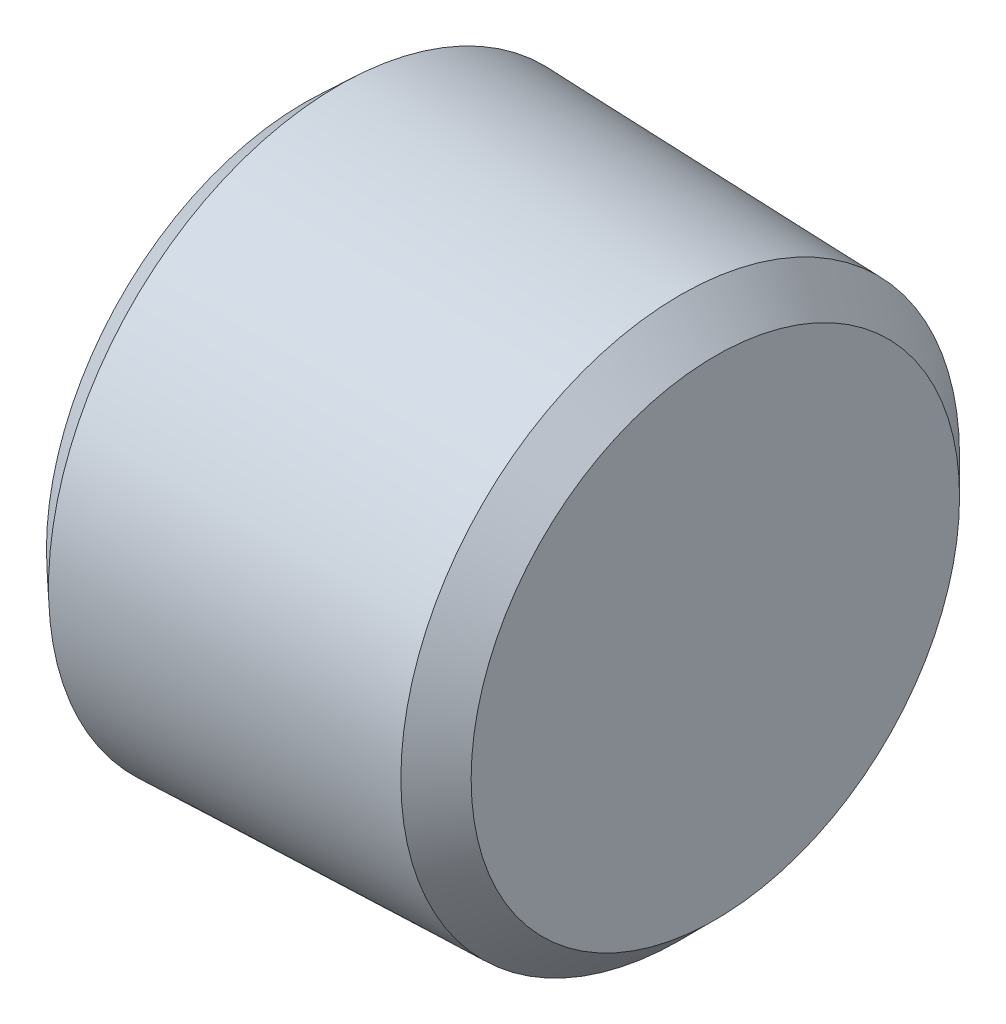
ISO-10303-21;
HEADER;
FILE_DESCRIPTION(('STEP AP214'),'2;1');
FILE_NAME('part.step','',(''),(''),'','','');
FILE_SCHEMA(('AUTOMOTIVE_DESIGN { 1 0 10303 214 1 1 1 1 }'));
ENDSEC;
DATA;
#1=APPLICATION_CONTEXT('core data for automotive mechanical design processes');
#2=APPLICATION_PROTOCOL_DEFINITION('international standard','automotive_design',2000,#1);
#3=PRODUCT_CONTEXT('',#1,'mechanical');
#4=PRODUCT('Part','Part','',(#3));
#5=PRODUCT_RELATED_PRODUCT_CATEGORY('part','',(#4));
#6=PRODUCT_DEFINITION_FORMATION('','',#4);
#7=PRODUCT_DEFINITION_CONTEXT('part definition',#1,'design');
#8=PRODUCT_DEFINITION('design','',#6,#7);
#9=PRODUCT_DEFINITION_SHAPE('','',#8);
#10=(LENGTH_UNIT() NAMED_UNIT(*) SI_UNIT(.MILLI.,.METRE.));
#11=(NAMED_UNIT(*) PLANE_ANGLE_UNIT() SI_UNIT($,.RADIAN.));
#12=(NAMED_UNIT(*) SI_UNIT($,.STERADIAN.) SOLID_ANGLE_UNIT());
#13=UNCERTAINTY_MEASURE_WITH_UNIT(LENGTH_MEASURE(1.E-05),#10,'distance_accuracy_value','');
#14=(GEOMETRIC_REPRESENTATION_CONTEXT(3) GLOBAL_UNCERTAINTY_ASSIGNED_CONTEXT((#13)) GLOBAL_UNIT_ASSIGNED_CONTEXT((#10,
#11,#12)) REPRESENTATION_CONTEXT('',''));
#15=CARTESIAN_POINT('',(0.,0.,0.));
#16=DIRECTION('',(0.,0.,1.));
#17=DIRECTION('',(1.,0.,0.));
#18=AXIS2_PLACEMENT_3D('',#15,#16,#17);
#19=CARTESIAN_POINT('',(0.,0.,0.));
#20=DIRECTION('',(1.,0.,0.));
#21=DIRECTION('',(0.,0.,-1.));
#22=AXIS2_PLACEMENT_3D('',#19,#20,#21);
#23=PLANE('',#22);
#24=DIRECTION('',(0.,0.866025403784438,-0.5));
#25=VECTOR('',#24,1.);
#26=CARTESIAN_POINT('',(0.,0.,2.74818728134262));
#27=LINE('',#26,#25);
#28=CARTESIAN_POINT('',(0.,0.,2.74818728134262));
#29=VERTEX_POINT('',#28);
#30=CARTESIAN_POINT('',(0.,2.38,1.37409364067131));
#31=VERTEX_POINT('',#30);
#32=EDGE_CURVE('E122',#29,#31,#27,.T.);
#33=ORIENTED_EDGE('',*,*,#32,.F.);
#34=DIRECTION('',(0.,0.866025403784439,0.5));
#35=VECTOR('',#34,1.);
#36=CARTESIAN_POINT('',(0.,-2.38,1.37409364067131));
#37=LINE('',#36,#35);
#38=CARTESIAN_POINT('',(0.,-2.38,1.37409364067131));
#39=VERTEX_POINT('',#38);
#40=EDGE_CURVE('E48',#39,#29,#37,.T.);
#41=ORIENTED_EDGE('',*,*,#40,.F.);
#42=DIRECTION('',(0.,0.,1.));
#43=VECTOR('',#42,1.);
#44=CARTESIAN_POINT('',(0.,-2.38,-1.37409364067131));
#45=LINE('',#44,#43);
#46=CARTESIAN_POINT('',(0.,-2.38,-1.37409364067131));
#47=VERTEX_POINT('',#46);
#48=EDGE_CURVE('E131',#47,#39,#45,.T.);
#49=ORIENTED_EDGE('',*,*,#48,.F.);
#50=DIRECTION('',(0.,-0.866025403784439,0.5));
#51=VECTOR('',#50,1.);
#52=CARTESIAN_POINT('',(0.,0.,-2.74818728134262));
#53=LINE('',#52,#51);
#54=CARTESIAN_POINT('',(0.,0.,-2.74818728134262));
#55=VERTEX_POINT('',#54);
#56=EDGE_CURVE('E129',#55,#47,#53,.T.);
#57=ORIENTED_EDGE('',*,*,#56,.F.);
#58=DIRECTION('',(0.,-0.866025403784439,-0.5));
#59=VECTOR('',#58,1.);
#60=CARTESIAN_POINT('',(0.,2.38,-1.37409364067131));
#61=LINE('',#60,#59);
#62=CARTESIAN_POINT('',(0.,2.38,-1.37409364067131));
#63=VERTEX_POINT('',#62);
#64=EDGE_CURVE('E96',#63,#55,#61,.T.);
#65=ORIENTED_EDGE('',*,*,#64,.F.);
#66=DIRECTION('',(0.,0.,-1.));
#67=VECTOR('',#66,1.);
#68=CARTESIAN_POINT('',(0.,2.38,1.37409364067131));
#69=LINE('',#68,#67);
#70=EDGE_CURVE('E125',#31,#63,#69,.T.);
#71=ORIENTED_EDGE('',*,*,#70,.F.);
#72=EDGE_LOOP('',(#33,#41,#49,#57,#65,#71));
#73=FACE_BOUND('',#72,.T.);
#74=CARTESIAN_POINT('',(0.,0.,0.));
#75=DIRECTION('',(1.,0.,0.));
#76=DIRECTION('',(0.,0.,-1.));
#77=AXIS2_PLACEMENT_3D('',#74,#75,#76);
#78=CIRCLE('',#77,4.39555912409694);
#79=CARTESIAN_POINT('',(0.,0.,-4.39555912409694));
#80=VERTEX_POINT('',#79);
#81=EDGE_CURVE('E11',#80,#80,#78,.F.);
#82=ORIENTED_EDGE('',*,*,#81,.T.);
#83=EDGE_LOOP('',(#82));
#84=FACE_BOUND('',#83,.T.);
#85=ADVANCED_FACE('F33',(#73,#84),#23,.F.);
#86=CARTESIAN_POINT('',(7.,0.,0.));
#87=DIRECTION('',(-1.,0.,0.));
#88=DIRECTION('',(0.,0.,1.));
#89=AXIS2_PLACEMENT_3D('',#86,#87,#88);
#90=CONICAL_SURFACE('',#89,4.74041679888903,0.031119220563059);
#91=CARTESIAN_POINT('',(6.40136492730975,0.,0.));
#92=DIRECTION('',(1.,0.,0.));
#93=DIRECTION('',(0.,0.,-1.));
#94=AXIS2_PLACEMENT_3D('',#91,#92,#93);
#95=CIRCLE('',#94,4.75905187157929);
#96=CARTESIAN_POINT('',(6.40136492730975,0.,-4.75905187157929));
#97=VERTEX_POINT('',#96);
#98=EDGE_CURVE('E143',#97,#97,#95,.F.);
#99=ORIENTED_EDGE('',*,*,#98,.T.);
#100=EDGE_LOOP('',(#99));
#101=FACE_BOUND('',#100,.T.);
#102=CARTESIAN_POINT('',(0.579719184955391,0.,0.));
#103=DIRECTION('',(1.,0.,0.));
#104=DIRECTION('',(0.,0.,-1.));
#105=AXIS2_PLACEMENT_3D('',#102,#103,#104);
#106=CIRCLE('',#105,4.94027545258036);
#107=CARTESIAN_POINT('',(0.579719184955391,0.,-4.94027545258036));
#108=VERTEX_POINT('',#107);
#109=EDGE_CURVE('E135',#108,#108,#106,.T.);
#110=ORIENTED_EDGE('',*,*,#109,.T.);
#111=EDGE_LOOP('',(#110));
#112=FACE_BOUND('',#111,.T.);
#113=ADVANCED_FACE('F155',(#101,#112),#90,.T.);
#114=CARTESIAN_POINT('',(7.,4.74041679888903,0.));
#115=DIRECTION('',(-1.,0.,0.));
#116=DIRECTION('',(0.,0.,1.));
#117=AXIS2_PLACEMENT_3D('',#114,#115,#116);
#118=PLANE('',#117);
#119=CARTESIAN_POINT('',(7.,0.,0.));
#120=DIRECTION('',(-1.,0.,0.));
#121=DIRECTION('',(0.,0.,1.));
#122=AXIS2_PLACEMENT_3D('',#119,#120,#121);
#123=CIRCLE('',#122,4.16041679888903);
#124=CARTESIAN_POINT('',(7.,0.,4.16041679888903));
#125=VERTEX_POINT('',#124);
#126=EDGE_CURVE('E41',#125,#125,#123,.F.);
#127=ORIENTED_EDGE('',*,*,#126,.T.);
#128=EDGE_LOOP('',(#127));
#129=FACE_BOUND('',#128,.T.);
#130=ADVANCED_FACE('F148',(#129),#118,.F.);
#131=CARTESIAN_POINT('',(6.40136492730973,0.,0.));
#132=DIRECTION('',(-1.,0.,0.));
#133=DIRECTION('',(0.,0.,1.));
#134=AXIS2_PLACEMENT_3D('',#131,#132,#133);
#135=CONICAL_SURFACE('',#134,4.75905187157929,0.785398163397448);
#136=ORIENTED_EDGE('',*,*,#126,.F.);
#137=EDGE_LOOP('',(#136));
#138=FACE_BOUND('',#137,.T.);
#139=ORIENTED_EDGE('',*,*,#98,.F.);
#140=EDGE_LOOP('',(#139));
#141=FACE_BOUND('',#140,.T.);
#142=ADVANCED_FACE('F150',(#138,#141),#135,.T.);
#143=CARTESIAN_POINT('',(0.,0.,0.));
#144=DIRECTION('',(1.,0.,0.));
#145=DIRECTION('',(0.,0.,-1.));
#146=AXIS2_PLACEMENT_3D('',#143,#144,#145);
#147=CONICAL_SURFACE('',#146,4.39555912409694,0.754278942834389);
#148=ORIENTED_EDGE('',*,*,#109,.F.);
#149=EDGE_LOOP('',(#148));
#150=FACE_BOUND('',#149,.T.);
#151=ORIENTED_EDGE('',*,*,#81,.F.);
#152=EDGE_LOOP('',(#151));
#153=FACE_BOUND('',#152,.T.);
#154=ADVANCED_FACE('F35',(#150,#153),#147,.T.);
#155=CARTESIAN_POINT('',(2.,-2.38,1.37409364067131));
#156=DIRECTION('',(0.,-0.5,0.866025403784439));
#157=DIRECTION('',(0.,-0.866025403784439,-0.5));
#158=AXIS2_PLACEMENT_3D('',#155,#156,#157);
#159=PLANE('',#158);
#160=ORIENTED_EDGE('',*,*,#40,.T.);
#161=DIRECTION('',(-1.,0.,0.));
#162=VECTOR('',#161,1.);
#163=CARTESIAN_POINT('',(2.,0.,2.74818728134262));
#164=LINE('',#163,#162);
#165=CARTESIAN_POINT('',(2.,0.,2.74818728134262));
#166=VERTEX_POINT('',#165);
#167=EDGE_CURVE('E78',#166,#29,#164,.T.);
#168=ORIENTED_EDGE('',*,*,#167,.F.);
#169=DIRECTION('',(0.,0.866025403784439,0.5));
#170=VECTOR('',#169,1.);
#171=CARTESIAN_POINT('',(2.,-2.38,1.37409364067131));
#172=LINE('',#171,#170);
#173=CARTESIAN_POINT('',(2.,-2.38,1.37409364067131));
#174=VERTEX_POINT('',#173);
#175=EDGE_CURVE('E133',#174,#166,#172,.T.);
#176=ORIENTED_EDGE('',*,*,#175,.F.);
#177=DIRECTION('',(-1.,0.,0.));
#178=VECTOR('',#177,1.);
#179=CARTESIAN_POINT('',(2.,-2.38,1.37409364067131));
#180=LINE('',#179,#178);
#181=EDGE_CURVE('E56',#174,#39,#180,.T.);
#182=ORIENTED_EDGE('',*,*,#181,.T.);
#183=EDGE_LOOP('',(#160,#168,#176,#182));
#184=FACE_BOUND('',#183,.T.);
#185=ADVANCED_FACE('F163',(#184),#159,.F.);
#186=CARTESIAN_POINT('',(2.,-2.38,-1.37409364067131));
#187=DIRECTION('',(0.,-1.,0.));
#188=DIRECTION('',(0.,0.,-1.));
#189=AXIS2_PLACEMENT_3D('',#186,#187,#188);
#190=PLANE('',#189);
#191=ORIENTED_EDGE('',*,*,#48,.T.);
#192=ORIENTED_EDGE('',*,*,#181,.F.);
#193=DIRECTION('',(0.,0.,1.));
#194=VECTOR('',#193,1.);
#195=CARTESIAN_POINT('',(2.,-2.38,-1.37409364067131));
#196=LINE('',#195,#194);
#197=CARTESIAN_POINT('',(2.,-2.38,-1.37409364067131));
#198=VERTEX_POINT('',#197);
#199=EDGE_CURVE('E108',#198,#174,#196,.T.);
#200=ORIENTED_EDGE('',*,*,#199,.F.);
#201=DIRECTION('',(-1.,0.,0.));
#202=VECTOR('',#201,1.);
#203=CARTESIAN_POINT('',(2.,-2.38,-1.37409364067131));
#204=LINE('',#203,#202);
#205=EDGE_CURVE('E100',#198,#47,#204,.T.);
#206=ORIENTED_EDGE('',*,*,#205,.T.);
#207=EDGE_LOOP('',(#191,#192,#200,#206));
#208=FACE_BOUND('',#207,.T.);
#209=ADVANCED_FACE('F177',(#208),#190,.F.);
#210=CARTESIAN_POINT('',(2.,0.,-2.74818728134262));
#211=DIRECTION('',(0.,-0.5,-0.866025403784439));
#212=DIRECTION('',(0.,0.866025403784439,-0.5));
#213=AXIS2_PLACEMENT_3D('',#210,#211,#212);
#214=PLANE('',#213);
#215=ORIENTED_EDGE('',*,*,#56,.T.);
#216=ORIENTED_EDGE('',*,*,#205,.F.);
#217=DIRECTION('',(0.,-0.866025403784439,0.5));
#218=VECTOR('',#217,1.);
#219=CARTESIAN_POINT('',(2.,0.,-2.74818728134262));
#220=LINE('',#219,#218);
#221=CARTESIAN_POINT('',(2.,0.,-2.74818728134262));
#222=VERTEX_POINT('',#221);
#223=EDGE_CURVE('E104',#222,#198,#220,.T.);
#224=ORIENTED_EDGE('',*,*,#223,.F.);
#225=DIRECTION('',(-1.,0.,0.));
#226=VECTOR('',#225,1.);
#227=CARTESIAN_POINT('',(2.,0.,-2.74818728134262));
#228=LINE('',#227,#226);
#229=EDGE_CURVE('E89',#222,#55,#228,.T.);
#230=ORIENTED_EDGE('',*,*,#229,.T.);
#231=EDGE_LOOP('',(#215,#216,#224,#230));
#232=FACE_BOUND('',#231,.T.);
#233=ADVANCED_FACE('F105',(#232),#214,.F.);
#234=CARTESIAN_POINT('',(2.,2.38,-1.37409364067131));
#235=DIRECTION('',(0.,0.5,-0.866025403784439));
#236=DIRECTION('',(0.,0.866025403784439,0.5));
#237=AXIS2_PLACEMENT_3D('',#234,#235,#236);
#238=PLANE('',#237);
#239=ORIENTED_EDGE('',*,*,#64,.T.);
#240=ORIENTED_EDGE('',*,*,#229,.F.);
#241=DIRECTION('',(0.,-0.866025403784439,-0.5));
#242=VECTOR('',#241,1.);
#243=CARTESIAN_POINT('',(2.,2.38,-1.37409364067131));
#244=LINE('',#243,#242);
#245=CARTESIAN_POINT('',(2.,2.38,-1.37409364067131));
#246=VERTEX_POINT('',#245);
#247=EDGE_CURVE('E93',#246,#222,#244,.T.);
#248=ORIENTED_EDGE('',*,*,#247,.F.);
#249=DIRECTION('',(-1.,0.,0.));
#250=VECTOR('',#249,1.);
#251=CARTESIAN_POINT('',(2.,2.38,-1.37409364067131));
#252=LINE('',#251,#250);
#253=EDGE_CURVE('E101',#246,#63,#252,.T.);
#254=ORIENTED_EDGE('',*,*,#253,.T.);
#255=EDGE_LOOP('',(#239,#240,#248,#254));
#256=FACE_BOUND('',#255,.T.);
#257=ADVANCED_FACE('F91',(#256),#238,.F.);
#258=CARTESIAN_POINT('',(2.,2.38,1.37409364067131));
#259=DIRECTION('',(0.,1.,0.));
#260=DIRECTION('',(0.,0.,1.));
#261=AXIS2_PLACEMENT_3D('',#258,#259,#260);
#262=PLANE('',#261);
#263=ORIENTED_EDGE('',*,*,#70,.T.);
#264=ORIENTED_EDGE('',*,*,#253,.F.);
#265=DIRECTION('',(0.,0.,-1.));
#266=VECTOR('',#265,1.);
#267=CARTESIAN_POINT('',(2.,2.38,1.37409364067131));
#268=LINE('',#267,#266);
#269=CARTESIAN_POINT('',(2.,2.38,1.37409364067131));
#270=VERTEX_POINT('',#269);
#271=EDGE_CURVE('E114',#270,#246,#268,.T.);
#272=ORIENTED_EDGE('',*,*,#271,.F.);
#273=DIRECTION('',(-1.,0.,0.));
#274=VECTOR('',#273,1.);
#275=CARTESIAN_POINT('',(2.,2.38,1.37409364067131));
#276=LINE('',#275,#274);
#277=EDGE_CURVE('E138',#270,#31,#276,.T.);
#278=ORIENTED_EDGE('',*,*,#277,.T.);
#279=EDGE_LOOP('',(#263,#264,#272,#278));
#280=FACE_BOUND('',#279,.T.);
#281=ADVANCED_FACE('F181',(#280),#262,.F.);
#282=CARTESIAN_POINT('',(2.,0.,2.74818728134262));
#283=DIRECTION('',(0.,0.5,0.866025403784439));
#284=DIRECTION('',(0.,-0.866025403784438,0.5));
#285=AXIS2_PLACEMENT_3D('',#282,#283,#284);
#286=PLANE('',#285);
#287=ORIENTED_EDGE('',*,*,#32,.T.);
#288=ORIENTED_EDGE('',*,*,#277,.F.);
#289=DIRECTION('',(0.,0.866025403784438,-0.5));
#290=VECTOR('',#289,1.);
#291=CARTESIAN_POINT('',(2.,0.,2.74818728134262));
#292=LINE('',#291,#290);
#293=EDGE_CURVE('E116',#166,#270,#292,.T.);
#294=ORIENTED_EDGE('',*,*,#293,.F.);
#295=ORIENTED_EDGE('',*,*,#167,.T.);
#296=EDGE_LOOP('',(#287,#288,#294,#295));
#297=FACE_BOUND('',#296,.T.);
#298=ADVANCED_FACE('F178',(#297),#286,.F.);
#299=CARTESIAN_POINT('',(2.,0.,2.74818728134262));
#300=DIRECTION('',(-1.,0.,0.));
#301=DIRECTION('',(0.,0.,1.));
#302=AXIS2_PLACEMENT_3D('',#299,#300,#301);
#303=PLANE('',#302);
#304=ORIENTED_EDGE('',*,*,#175,.T.);
#305=ORIENTED_EDGE('',*,*,#293,.T.);
#306=ORIENTED_EDGE('',*,*,#271,.T.);
#307=ORIENTED_EDGE('',*,*,#247,.T.);
#308=ORIENTED_EDGE('',*,*,#223,.T.);
#309=ORIENTED_EDGE('',*,*,#199,.T.);
#310=EDGE_LOOP('',(#304,#305,#306,#307,#308,#309));
#311=FACE_BOUND('',#310,.T.);
#312=ADVANCED_FACE('F111',(#311),#303,.T.);
#313=CLOSED_SHELL('',(#85,#113,#130,#142,#154,#185,#209,#233,#257,#281,#298,#312));
#314=MANIFOLD_SOLID_BREP('B2',#313);
#315=ADVANCED_BREP_SHAPE_REPRESENTATION('',(#18,#314),#14);
#316=SHAPE_DEFINITION_REPRESENTATION(#9,#315);
ENDSEC;
END-ISO-10303-21;
